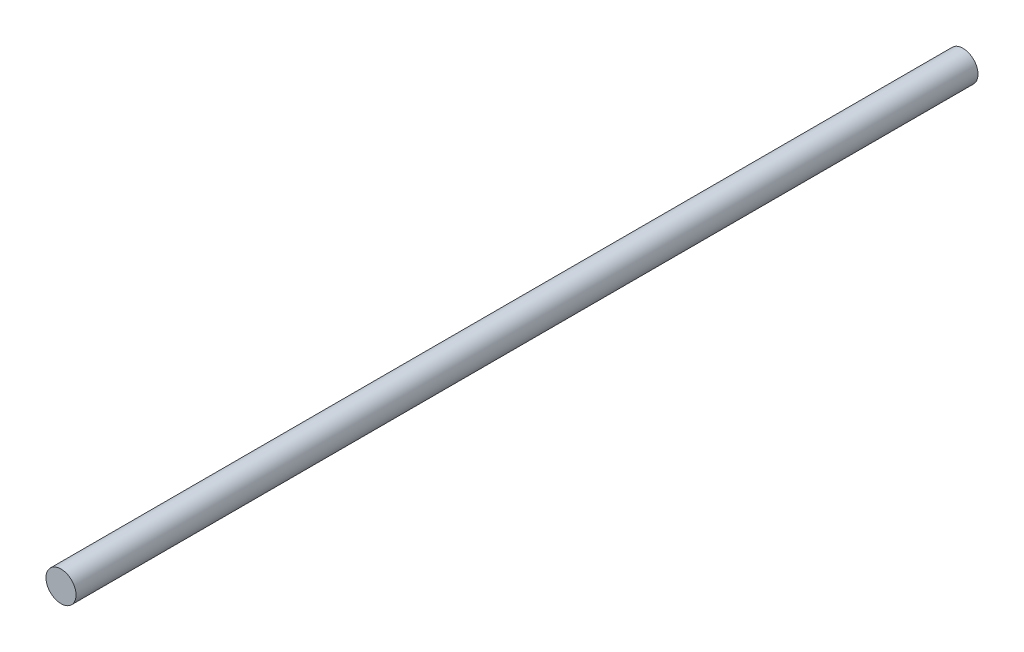
ISO-10303-21;
HEADER;
FILE_DESCRIPTION(('STEP AP214'),'2;1');
FILE_NAME('part.step','',(''),(''),'','','');
FILE_SCHEMA(('AUTOMOTIVE_DESIGN { 1 0 10303 214 1 1 1 1 }'));
ENDSEC;
DATA;
#1=APPLICATION_CONTEXT('core data for automotive mechanical design processes');
#2=APPLICATION_PROTOCOL_DEFINITION('international standard','automotive_design',2000,#1);
#3=PRODUCT_CONTEXT('',#1,'mechanical');
#4=PRODUCT('Part','Part','',(#3));
#5=PRODUCT_RELATED_PRODUCT_CATEGORY('part','',(#4));
#6=PRODUCT_DEFINITION_FORMATION('','',#4);
#7=PRODUCT_DEFINITION_CONTEXT('part definition',#1,'design');
#8=PRODUCT_DEFINITION('design','',#6,#7);
#9=PRODUCT_DEFINITION_SHAPE('','',#8);
#10=(LENGTH_UNIT() NAMED_UNIT(*) SI_UNIT(.MILLI.,.METRE.));
#11=(NAMED_UNIT(*) PLANE_ANGLE_UNIT() SI_UNIT($,.RADIAN.));
#12=(NAMED_UNIT(*) SI_UNIT($,.STERADIAN.) SOLID_ANGLE_UNIT());
#13=UNCERTAINTY_MEASURE_WITH_UNIT(LENGTH_MEASURE(1.E-05),#10,'distance_accuracy_value','');
#14=(GEOMETRIC_REPRESENTATION_CONTEXT(3) GLOBAL_UNCERTAINTY_ASSIGNED_CONTEXT((#13)) GLOBAL_UNIT_ASSIGNED_CONTEXT((#10,
#11,#12)) REPRESENTATION_CONTEXT('',''));
#15=CARTESIAN_POINT('',(0.,0.,0.));
#16=DIRECTION('',(0.,0.,1.));
#17=DIRECTION('',(1.,0.,0.));
#18=AXIS2_PLACEMENT_3D('',#15,#16,#17);
#19=CARTESIAN_POINT('',(0.,0.,120.));
#20=DIRECTION('',(0.,0.,-1.));
#21=DIRECTION('',(-1.,0.,0.));
#22=AXIS2_PLACEMENT_3D('',#19,#20,#21);
#23=CYLINDRICAL_SURFACE('',#22,2.);
#24=CARTESIAN_POINT('',(0.,0.,120.));
#25=DIRECTION('',(0.,0.,1.));
#26=DIRECTION('',(1.,0.,0.));
#27=AXIS2_PLACEMENT_3D('',#24,#25,#26);
#28=CIRCLE('',#27,2.);
#29=CARTESIAN_POINT('',(2.,0.,120.));
#30=VERTEX_POINT('',#29);
#31=EDGE_CURVE('E10',#30,#30,#28,.T.);
#32=ORIENTED_EDGE('',*,*,#31,.F.);
#33=EDGE_LOOP('',(#32));
#34=FACE_BOUND('',#33,.T.);
#35=CARTESIAN_POINT('',(0.,0.,0.));
#36=DIRECTION('',(0.,0.,1.));
#37=DIRECTION('',(1.,0.,0.));
#38=AXIS2_PLACEMENT_3D('',#35,#36,#37);
#39=CIRCLE('',#38,2.);
#40=CARTESIAN_POINT('',(2.,0.,0.));
#41=VERTEX_POINT('',#40);
#42=EDGE_CURVE('E33',#41,#41,#39,.T.);
#43=ORIENTED_EDGE('',*,*,#42,.T.);
#44=EDGE_LOOP('',(#43));
#45=FACE_BOUND('',#44,.T.);
#46=ADVANCED_FACE('F30',(#34,#45),#23,.T.);
#47=CARTESIAN_POINT('',(0.,0.,120.));
#48=DIRECTION('',(0.,0.,1.));
#49=DIRECTION('',(1.,0.,0.));
#50=AXIS2_PLACEMENT_3D('',#47,#48,#49);
#51=PLANE('',#50);
#52=ORIENTED_EDGE('',*,*,#31,.T.);
#53=EDGE_LOOP('',(#52));
#54=FACE_BOUND('',#53,.T.);
#55=ADVANCED_FACE('F45',(#54),#51,.T.);
#56=CARTESIAN_POINT('',(0.,0.,0.));
#57=DIRECTION('',(0.,0.,1.));
#58=DIRECTION('',(1.,0.,0.));
#59=AXIS2_PLACEMENT_3D('',#56,#57,#58);
#60=PLANE('',#59);
#61=ORIENTED_EDGE('',*,*,#42,.F.);
#62=EDGE_LOOP('',(#61));
#63=FACE_BOUND('',#62,.T.);
#64=ADVANCED_FACE('F43',(#63),#60,.F.);
#65=CLOSED_SHELL('',(#46,#55,#64));
#66=MANIFOLD_SOLID_BREP('B2',#65);
#67=ADVANCED_BREP_SHAPE_REPRESENTATION('',(#18,#66),#14);
#68=SHAPE_DEFINITION_REPRESENTATION(#9,#67);
ENDSEC;
END-ISO-10303-21;
